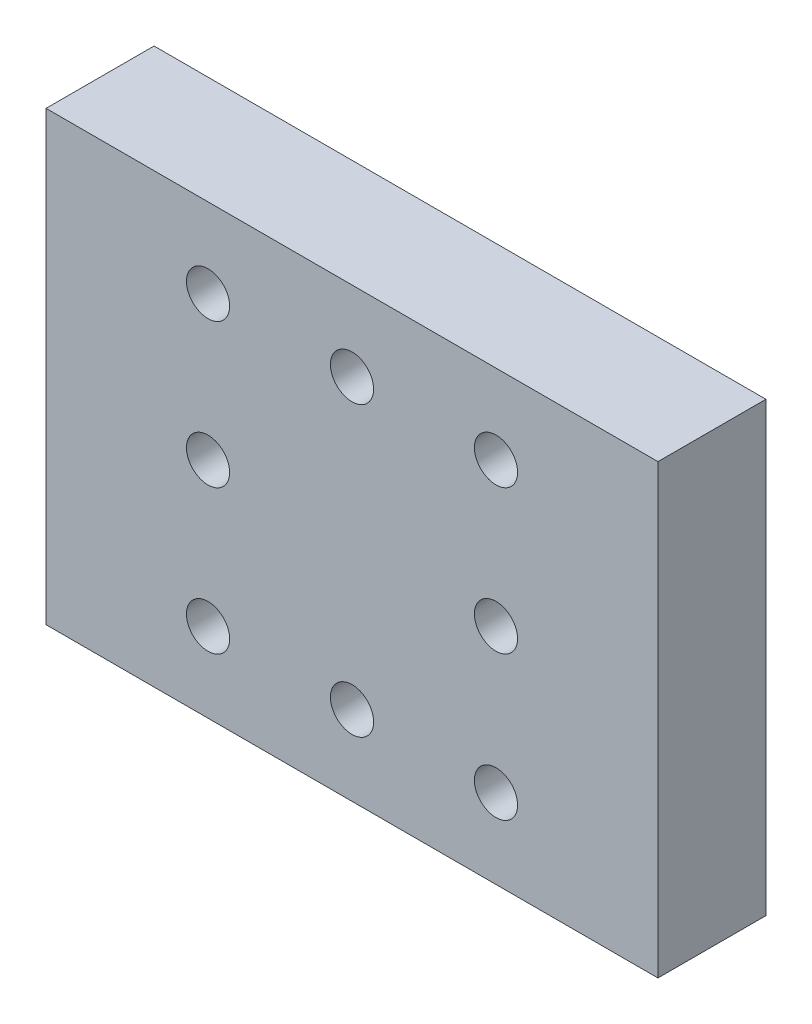
ISO-10303-21;
HEADER;
FILE_DESCRIPTION(('STEP AP214'),'2;1');
FILE_NAME('part.step','',(''),(''),'','','');
FILE_SCHEMA(('AUTOMOTIVE_DESIGN { 1 0 10303 214 1 1 1 1 }'));
ENDSEC;
DATA;
#1=APPLICATION_CONTEXT('core data for automotive mechanical design processes');
#2=APPLICATION_PROTOCOL_DEFINITION('international standard','automotive_design',2000,#1);
#3=PRODUCT_CONTEXT('',#1,'mechanical');
#4=PRODUCT('Part','Part','',(#3));
#5=PRODUCT_RELATED_PRODUCT_CATEGORY('part','',(#4));
#6=PRODUCT_DEFINITION_FORMATION('','',#4);
#7=PRODUCT_DEFINITION_CONTEXT('part definition',#1,'design');
#8=PRODUCT_DEFINITION('design','',#6,#7);
#9=PRODUCT_DEFINITION_SHAPE('','',#8);
#10=(LENGTH_UNIT() NAMED_UNIT(*) SI_UNIT(.MILLI.,.METRE.));
#11=(NAMED_UNIT(*) PLANE_ANGLE_UNIT() SI_UNIT($,.RADIAN.));
#12=(NAMED_UNIT(*) SI_UNIT($,.STERADIAN.) SOLID_ANGLE_UNIT());
#13=UNCERTAINTY_MEASURE_WITH_UNIT(LENGTH_MEASURE(1.E-05),#10,'distance_accuracy_value','');
#14=(GEOMETRIC_REPRESENTATION_CONTEXT(3) GLOBAL_UNCERTAINTY_ASSIGNED_CONTEXT((#13)) GLOBAL_UNIT_ASSIGNED_CONTEXT((#10,
#11,#12)) REPRESENTATION_CONTEXT('',''));
#15=CARTESIAN_POINT('',(0.,0.,0.));
#16=DIRECTION('',(0.,0.,1.));
#17=DIRECTION('',(1.,0.,0.));
#18=AXIS2_PLACEMENT_3D('',#15,#16,#17);
#19=CARTESIAN_POINT('',(16.9999999999999,12.425,6.));
#20=DIRECTION('',(-1.,0.,0.));
#21=DIRECTION('',(0.,-1.,0.));
#22=AXIS2_PLACEMENT_3D('',#19,#20,#21);
#23=PLANE('',#22);
#24=DIRECTION('',(0.,1.,0.));
#25=VECTOR('',#24,1.);
#26=CARTESIAN_POINT('',(16.9999999999999,12.425,0.));
#27=LINE('',#26,#25);
#28=CARTESIAN_POINT('',(16.9999999999999,-12.425,0.));
#29=VERTEX_POINT('',#28);
#30=CARTESIAN_POINT('',(16.9999999999999,12.425,0.));
#31=VERTEX_POINT('',#30);
#32=EDGE_CURVE('E95',#29,#31,#27,.T.);
#33=ORIENTED_EDGE('',*,*,#32,.T.);
#34=DIRECTION('',(0.,0.,-1.));
#35=VECTOR('',#34,1.);
#36=CARTESIAN_POINT('',(16.9999999999999,12.425,6.));
#37=LINE('',#36,#35);
#38=CARTESIAN_POINT('',(16.9999999999999,12.425,6.));
#39=VERTEX_POINT('',#38);
#40=EDGE_CURVE('E11',#39,#31,#37,.T.);
#41=ORIENTED_EDGE('',*,*,#40,.F.);
#42=DIRECTION('',(0.,1.,0.));
#43=VECTOR('',#42,1.);
#44=CARTESIAN_POINT('',(16.9999999999999,12.425,6.));
#45=LINE('',#44,#43);
#46=CARTESIAN_POINT('',(16.9999999999999,-12.425,6.));
#47=VERTEX_POINT('',#46);
#48=EDGE_CURVE('E83',#47,#39,#45,.T.);
#49=ORIENTED_EDGE('',*,*,#48,.F.);
#50=DIRECTION('',(0.,0.,-1.));
#51=VECTOR('',#50,1.);
#52=CARTESIAN_POINT('',(16.9999999999999,-12.425,6.));
#53=LINE('',#52,#51);
#54=EDGE_CURVE('E91',#47,#29,#53,.T.);
#55=ORIENTED_EDGE('',*,*,#54,.T.);
#56=EDGE_LOOP('',(#33,#41,#49,#55));
#57=FACE_BOUND('',#56,.T.);
#58=ADVANCED_FACE('F32',(#57),#23,.F.);
#59=CARTESIAN_POINT('',(-17.,12.425,6.));
#60=DIRECTION('',(0.,-1.,0.));
#61=DIRECTION('',(0.,0.,-1.));
#62=AXIS2_PLACEMENT_3D('',#59,#60,#61);
#63=PLANE('',#62);
#64=DIRECTION('',(-1.,0.,0.));
#65=VECTOR('',#64,1.);
#66=CARTESIAN_POINT('',(-17.,12.425,0.));
#67=LINE('',#66,#65);
#68=CARTESIAN_POINT('',(-17.,12.425,0.));
#69=VERTEX_POINT('',#68);
#70=EDGE_CURVE('E87',#31,#69,#67,.T.);
#71=ORIENTED_EDGE('',*,*,#70,.T.);
#72=DIRECTION('',(0.,0.,-1.));
#73=VECTOR('',#72,1.);
#74=CARTESIAN_POINT('',(-17.,12.425,6.));
#75=LINE('',#74,#73);
#76=CARTESIAN_POINT('',(-17.,12.425,6.));
#77=VERTEX_POINT('',#76);
#78=EDGE_CURVE('E40',#77,#69,#75,.T.);
#79=ORIENTED_EDGE('',*,*,#78,.F.);
#80=DIRECTION('',(-1.,0.,0.));
#81=VECTOR('',#80,1.);
#82=CARTESIAN_POINT('',(-17.,12.425,6.));
#83=LINE('',#82,#81);
#84=EDGE_CURVE('E78',#39,#77,#83,.T.);
#85=ORIENTED_EDGE('',*,*,#84,.F.);
#86=ORIENTED_EDGE('',*,*,#40,.T.);
#87=EDGE_LOOP('',(#71,#79,#85,#86));
#88=FACE_BOUND('',#87,.T.);
#89=ADVANCED_FACE('F86',(#88),#63,.F.);
#90=CARTESIAN_POINT('',(-17.,12.425,6.));
#91=DIRECTION('',(1.,0.,0.));
#92=DIRECTION('',(0.,1.,0.));
#93=AXIS2_PLACEMENT_3D('',#90,#91,#92);
#94=PLANE('',#93);
#95=DIRECTION('',(0.,-1.,0.));
#96=VECTOR('',#95,1.);
#97=CARTESIAN_POINT('',(-17.,12.425,0.));
#98=LINE('',#97,#96);
#99=CARTESIAN_POINT('',(-17.,-12.425,0.));
#100=VERTEX_POINT('',#99);
#101=EDGE_CURVE('E65',#69,#100,#98,.T.);
#102=ORIENTED_EDGE('',*,*,#101,.T.);
#103=DIRECTION('',(0.,0.,-1.));
#104=VECTOR('',#103,1.);
#105=CARTESIAN_POINT('',(-17.,-12.425,6.));
#106=LINE('',#105,#104);
#107=CARTESIAN_POINT('',(-17.,-12.425,6.));
#108=VERTEX_POINT('',#107);
#109=EDGE_CURVE('E88',#108,#100,#106,.T.);
#110=ORIENTED_EDGE('',*,*,#109,.F.);
#111=DIRECTION('',(0.,-1.,0.));
#112=VECTOR('',#111,1.);
#113=CARTESIAN_POINT('',(-17.,12.425,6.));
#114=LINE('',#113,#112);
#115=EDGE_CURVE('E81',#77,#108,#114,.T.);
#116=ORIENTED_EDGE('',*,*,#115,.F.);
#117=ORIENTED_EDGE('',*,*,#78,.T.);
#118=EDGE_LOOP('',(#102,#110,#116,#117));
#119=FACE_BOUND('',#118,.T.);
#120=ADVANCED_FACE('F89',(#119),#94,.F.);
#121=CARTESIAN_POINT('',(-17.,-12.425,6.));
#122=DIRECTION('',(0.,1.,0.));
#123=DIRECTION('',(0.,0.,1.));
#124=AXIS2_PLACEMENT_3D('',#121,#122,#123);
#125=PLANE('',#124);
#126=DIRECTION('',(1.,0.,0.));
#127=VECTOR('',#126,1.);
#128=CARTESIAN_POINT('',(-17.,-12.425,0.));
#129=LINE('',#128,#127);
#130=EDGE_CURVE('E71',#100,#29,#129,.T.);
#131=ORIENTED_EDGE('',*,*,#130,.T.);
#132=ORIENTED_EDGE('',*,*,#54,.F.);
#133=DIRECTION('',(1.,0.,0.));
#134=VECTOR('',#133,1.);
#135=CARTESIAN_POINT('',(-17.,-12.425,6.));
#136=LINE('',#135,#134);
#137=EDGE_CURVE('E48',#108,#47,#136,.T.);
#138=ORIENTED_EDGE('',*,*,#137,.F.);
#139=ORIENTED_EDGE('',*,*,#109,.T.);
#140=EDGE_LOOP('',(#131,#132,#138,#139));
#141=FACE_BOUND('',#140,.T.);
#142=ADVANCED_FACE('F103',(#141),#125,.F.);
#143=CARTESIAN_POINT('',(0.,0.,6.));
#144=DIRECTION('',(0.,0.,1.));
#145=DIRECTION('',(1.,0.,0.));
#146=AXIS2_PLACEMENT_3D('',#143,#144,#145);
#147=PLANE('',#146);
#148=CARTESIAN_POINT('',(8.00000000003318,0.,6.));
#149=DIRECTION('',(0.,0.,1.));
#150=DIRECTION('',(1.,0.,0.));
#151=AXIS2_PLACEMENT_3D('',#148,#149,#150);
#152=CIRCLE('',#151,1.2);
#153=CARTESIAN_POINT('',(9.20000000003318,0.,6.));
#154=VERTEX_POINT('',#153);
#155=EDGE_CURVE('E151',#154,#154,#152,.T.);
#156=ORIENTED_EDGE('',*,*,#155,.F.);
#157=EDGE_LOOP('',(#156));
#158=FACE_BOUND('',#157,.T.);
#159=CARTESIAN_POINT('',(-7.99999999997646,0.,6.));
#160=DIRECTION('',(0.,0.,1.));
#161=DIRECTION('',(1.,0.,0.));
#162=AXIS2_PLACEMENT_3D('',#159,#160,#161);
#163=CIRCLE('',#162,1.2);
#164=CARTESIAN_POINT('',(-6.79999999997646,0.,6.));
#165=VERTEX_POINT('',#164);
#166=EDGE_CURVE('E145',#165,#165,#163,.T.);
#167=ORIENTED_EDGE('',*,*,#166,.F.);
#168=EDGE_LOOP('',(#167));
#169=FACE_BOUND('',#168,.T.);
#170=CARTESIAN_POINT('',(-7.99999999999999,-8.00500000000016,6.));
#171=DIRECTION('',(0.,0.,1.));
#172=DIRECTION('',(-1.,0.,0.));
#173=AXIS2_PLACEMENT_3D('',#170,#171,#172);
#174=CIRCLE('',#173,1.2);
#175=CARTESIAN_POINT('',(-9.19999999999999,-8.00500000000016,6.));
#176=VERTEX_POINT('',#175);
#177=EDGE_CURVE('E139',#176,#176,#174,.T.);
#178=ORIENTED_EDGE('',*,*,#177,.F.);
#179=EDGE_LOOP('',(#178));
#180=FACE_BOUND('',#179,.T.);
#181=CARTESIAN_POINT('',(7.99999999999973,-8.00500000000017,6.));
#182=DIRECTION('',(0.,0.,1.));
#183=DIRECTION('',(1.,0.,0.));
#184=AXIS2_PLACEMENT_3D('',#181,#182,#183);
#185=CIRCLE('',#184,1.2);
#186=CARTESIAN_POINT('',(9.19999999999973,-8.00500000000017,6.));
#187=VERTEX_POINT('',#186);
#188=EDGE_CURVE('E133',#187,#187,#185,.T.);
#189=ORIENTED_EDGE('',*,*,#188,.F.);
#190=EDGE_LOOP('',(#189));
#191=FACE_BOUND('',#190,.T.);
#192=CARTESIAN_POINT('',(-1.29973142336363E-13,-8.00499999999875,6.));
#193=DIRECTION('',(0.,0.,1.));
#194=DIRECTION('',(-1.,0.,0.));
#195=AXIS2_PLACEMENT_3D('',#192,#193,#194);
#196=CIRCLE('',#195,1.2);
#197=CARTESIAN_POINT('',(-1.20000000000013,-8.00499999999875,6.));
#198=VERTEX_POINT('',#197);
#199=EDGE_CURVE('E127',#198,#198,#196,.T.);
#200=ORIENTED_EDGE('',*,*,#199,.F.);
#201=EDGE_LOOP('',(#200));
#202=FACE_BOUND('',#201,.T.);
#203=CARTESIAN_POINT('',(-1.29973142336363E-13,8.00499999999857,6.));
#204=DIRECTION('',(0.,0.,1.));
#205=DIRECTION('',(1.,0.,0.));
#206=AXIS2_PLACEMENT_3D('',#203,#204,#205);
#207=CIRCLE('',#206,1.2);
#208=CARTESIAN_POINT('',(1.19999999999987,8.00499999999857,6.));
#209=VERTEX_POINT('',#208);
#210=EDGE_CURVE('E121',#209,#209,#207,.T.);
#211=ORIENTED_EDGE('',*,*,#210,.F.);
#212=EDGE_LOOP('',(#211));
#213=FACE_BOUND('',#212,.T.);
#214=CARTESIAN_POINT('',(7.99999999999973,8.00499999999999,6.));
#215=DIRECTION('',(0.,0.,1.));
#216=DIRECTION('',(-1.,0.,0.));
#217=AXIS2_PLACEMENT_3D('',#214,#215,#216);
#218=CIRCLE('',#217,1.2);
#219=CARTESIAN_POINT('',(6.79999999999973,8.00499999999999,6.));
#220=VERTEX_POINT('',#219);
#221=EDGE_CURVE('E115',#220,#220,#218,.T.);
#222=ORIENTED_EDGE('',*,*,#221,.F.);
#223=EDGE_LOOP('',(#222));
#224=FACE_BOUND('',#223,.T.);
#225=CARTESIAN_POINT('',(-7.99999999999999,8.00499999999999,6.));
#226=DIRECTION('',(0.,0.,1.));
#227=DIRECTION('',(1.,0.,0.));
#228=AXIS2_PLACEMENT_3D('',#225,#226,#227);
#229=CIRCLE('',#228,1.2);
#230=CARTESIAN_POINT('',(-6.79999999999999,8.00499999999999,6.));
#231=VERTEX_POINT('',#230);
#232=EDGE_CURVE('E109',#231,#231,#229,.T.);
#233=ORIENTED_EDGE('',*,*,#232,.F.);
#234=EDGE_LOOP('',(#233));
#235=FACE_BOUND('',#234,.T.);
#236=ORIENTED_EDGE('',*,*,#48,.T.);
#237=ORIENTED_EDGE('',*,*,#84,.T.);
#238=ORIENTED_EDGE('',*,*,#115,.T.);
#239=ORIENTED_EDGE('',*,*,#137,.T.);
#240=EDGE_LOOP('',(#236,#237,#238,#239));
#241=FACE_BOUND('',#240,.T.);
#242=ADVANCED_FACE('F79',(#158,#169,#180,#191,#202,#213,#224,#235,#241),#147,.T.);
#243=CARTESIAN_POINT('',(0.,0.,0.));
#244=DIRECTION('',(0.,0.,1.));
#245=DIRECTION('',(1.,0.,0.));
#246=AXIS2_PLACEMENT_3D('',#243,#244,#245);
#247=PLANE('',#246);
#248=CARTESIAN_POINT('',(8.00000000003318,0.,0.));
#249=DIRECTION('',(0.,0.,1.));
#250=DIRECTION('',(1.,0.,0.));
#251=AXIS2_PLACEMENT_3D('',#248,#249,#250);
#252=CIRCLE('',#251,1.2);
#253=CARTESIAN_POINT('',(9.20000000003318,0.,0.));
#254=VERTEX_POINT('',#253);
#255=EDGE_CURVE('E148',#254,#254,#252,.T.);
#256=ORIENTED_EDGE('',*,*,#255,.T.);
#257=EDGE_LOOP('',(#256));
#258=FACE_BOUND('',#257,.T.);
#259=CARTESIAN_POINT('',(-7.99999999997646,0.,0.));
#260=DIRECTION('',(0.,0.,1.));
#261=DIRECTION('',(1.,0.,0.));
#262=AXIS2_PLACEMENT_3D('',#259,#260,#261);
#263=CIRCLE('',#262,1.2);
#264=CARTESIAN_POINT('',(-6.79999999997646,0.,0.));
#265=VERTEX_POINT('',#264);
#266=EDGE_CURVE('E142',#265,#265,#263,.T.);
#267=ORIENTED_EDGE('',*,*,#266,.T.);
#268=EDGE_LOOP('',(#267));
#269=FACE_BOUND('',#268,.T.);
#270=CARTESIAN_POINT('',(-7.99999999999999,-8.00500000000016,0.));
#271=DIRECTION('',(0.,0.,1.));
#272=DIRECTION('',(-1.,0.,0.));
#273=AXIS2_PLACEMENT_3D('',#270,#271,#272);
#274=CIRCLE('',#273,1.2);
#275=CARTESIAN_POINT('',(-9.19999999999999,-8.00500000000016,0.));
#276=VERTEX_POINT('',#275);
#277=EDGE_CURVE('E136',#276,#276,#274,.T.);
#278=ORIENTED_EDGE('',*,*,#277,.T.);
#279=EDGE_LOOP('',(#278));
#280=FACE_BOUND('',#279,.T.);
#281=CARTESIAN_POINT('',(7.99999999999973,-8.00500000000017,0.));
#282=DIRECTION('',(0.,0.,1.));
#283=DIRECTION('',(1.,0.,0.));
#284=AXIS2_PLACEMENT_3D('',#281,#282,#283);
#285=CIRCLE('',#284,1.2);
#286=CARTESIAN_POINT('',(9.19999999999973,-8.00500000000017,0.));
#287=VERTEX_POINT('',#286);
#288=EDGE_CURVE('E130',#287,#287,#285,.T.);
#289=ORIENTED_EDGE('',*,*,#288,.T.);
#290=EDGE_LOOP('',(#289));
#291=FACE_BOUND('',#290,.T.);
#292=CARTESIAN_POINT('',(-1.29973142336363E-13,-8.00499999999875,0.));
#293=DIRECTION('',(0.,0.,1.));
#294=DIRECTION('',(-1.,0.,0.));
#295=AXIS2_PLACEMENT_3D('',#292,#293,#294);
#296=CIRCLE('',#295,1.2);
#297=CARTESIAN_POINT('',(-1.20000000000013,-8.00499999999875,0.));
#298=VERTEX_POINT('',#297);
#299=EDGE_CURVE('E124',#298,#298,#296,.T.);
#300=ORIENTED_EDGE('',*,*,#299,.T.);
#301=EDGE_LOOP('',(#300));
#302=FACE_BOUND('',#301,.T.);
#303=CARTESIAN_POINT('',(-1.29973142336363E-13,8.00499999999857,0.));
#304=DIRECTION('',(0.,0.,1.));
#305=DIRECTION('',(1.,0.,0.));
#306=AXIS2_PLACEMENT_3D('',#303,#304,#305);
#307=CIRCLE('',#306,1.2);
#308=CARTESIAN_POINT('',(1.19999999999987,8.00499999999857,0.));
#309=VERTEX_POINT('',#308);
#310=EDGE_CURVE('E118',#309,#309,#307,.T.);
#311=ORIENTED_EDGE('',*,*,#310,.T.);
#312=EDGE_LOOP('',(#311));
#313=FACE_BOUND('',#312,.T.);
#314=CARTESIAN_POINT('',(7.99999999999973,8.00499999999999,0.));
#315=DIRECTION('',(0.,0.,1.));
#316=DIRECTION('',(-1.,0.,0.));
#317=AXIS2_PLACEMENT_3D('',#314,#315,#316);
#318=CIRCLE('',#317,1.2);
#319=CARTESIAN_POINT('',(6.79999999999973,8.00499999999999,0.));
#320=VERTEX_POINT('',#319);
#321=EDGE_CURVE('E112',#320,#320,#318,.T.);
#322=ORIENTED_EDGE('',*,*,#321,.T.);
#323=EDGE_LOOP('',(#322));
#324=FACE_BOUND('',#323,.T.);
#325=CARTESIAN_POINT('',(-7.99999999999999,8.00499999999999,0.));
#326=DIRECTION('',(0.,0.,1.));
#327=DIRECTION('',(1.,0.,0.));
#328=AXIS2_PLACEMENT_3D('',#325,#326,#327);
#329=CIRCLE('',#328,1.2);
#330=CARTESIAN_POINT('',(-6.79999999999999,8.00499999999999,0.));
#331=VERTEX_POINT('',#330);
#332=EDGE_CURVE('E98',#331,#331,#329,.T.);
#333=ORIENTED_EDGE('',*,*,#332,.T.);
#334=EDGE_LOOP('',(#333));
#335=FACE_BOUND('',#334,.T.);
#336=ORIENTED_EDGE('',*,*,#32,.F.);
#337=ORIENTED_EDGE('',*,*,#130,.F.);
#338=ORIENTED_EDGE('',*,*,#101,.F.);
#339=ORIENTED_EDGE('',*,*,#70,.F.);
#340=EDGE_LOOP('',(#336,#337,#338,#339));
#341=FACE_BOUND('',#340,.T.);
#342=ADVANCED_FACE('F106',(#258,#269,#280,#291,#302,#313,#324,#335,#341),#247,.F.);
#343=CARTESIAN_POINT('',(-7.99999999999999,8.00499999999999,0.));
#344=DIRECTION('',(0.,0.,1.));
#345=DIRECTION('',(1.,0.,0.));
#346=AXIS2_PLACEMENT_3D('',#343,#344,#345);
#347=CYLINDRICAL_SURFACE('',#346,1.2);
#348=ORIENTED_EDGE('',*,*,#332,.F.);
#349=EDGE_LOOP('',(#348));
#350=FACE_BOUND('',#349,.T.);
#351=ORIENTED_EDGE('',*,*,#232,.T.);
#352=EDGE_LOOP('',(#351));
#353=FACE_BOUND('',#352,.T.);
#354=ADVANCED_FACE('F183',(#350,#353),#347,.F.);
#355=CARTESIAN_POINT('',(7.99999999999973,8.00499999999999,0.));
#356=DIRECTION('',(0.,0.,1.));
#357=DIRECTION('',(1.,0.,0.));
#358=AXIS2_PLACEMENT_3D('',#355,#356,#357);
#359=CYLINDRICAL_SURFACE('',#358,1.2);
#360=ORIENTED_EDGE('',*,*,#321,.F.);
#361=EDGE_LOOP('',(#360));
#362=FACE_BOUND('',#361,.T.);
#363=ORIENTED_EDGE('',*,*,#221,.T.);
#364=EDGE_LOOP('',(#363));
#365=FACE_BOUND('',#364,.T.);
#366=ADVANCED_FACE('F185',(#362,#365),#359,.F.);
#367=CARTESIAN_POINT('',(-1.29973142336363E-13,8.00499999999857,0.));
#368=DIRECTION('',(0.,0.,1.));
#369=DIRECTION('',(1.,0.,0.));
#370=AXIS2_PLACEMENT_3D('',#367,#368,#369);
#371=CYLINDRICAL_SURFACE('',#370,1.2);
#372=ORIENTED_EDGE('',*,*,#310,.F.);
#373=EDGE_LOOP('',(#372));
#374=FACE_BOUND('',#373,.T.);
#375=ORIENTED_EDGE('',*,*,#210,.T.);
#376=EDGE_LOOP('',(#375));
#377=FACE_BOUND('',#376,.T.);
#378=ADVANCED_FACE('F192',(#374,#377),#371,.F.);
#379=CARTESIAN_POINT('',(-1.29973142336363E-13,-8.00499999999875,0.));
#380=DIRECTION('',(0.,0.,1.));
#381=DIRECTION('',(1.,0.,0.));
#382=AXIS2_PLACEMENT_3D('',#379,#380,#381);
#383=CYLINDRICAL_SURFACE('',#382,1.2);
#384=ORIENTED_EDGE('',*,*,#299,.F.);
#385=EDGE_LOOP('',(#384));
#386=FACE_BOUND('',#385,.T.);
#387=ORIENTED_EDGE('',*,*,#199,.T.);
#388=EDGE_LOOP('',(#387));
#389=FACE_BOUND('',#388,.T.);
#390=ADVANCED_FACE('F238',(#386,#389),#383,.F.);
#391=CARTESIAN_POINT('',(7.99999999999973,-8.00500000000017,0.));
#392=DIRECTION('',(0.,0.,1.));
#393=DIRECTION('',(1.,0.,0.));
#394=AXIS2_PLACEMENT_3D('',#391,#392,#393);
#395=CYLINDRICAL_SURFACE('',#394,1.2);
#396=ORIENTED_EDGE('',*,*,#288,.F.);
#397=EDGE_LOOP('',(#396));
#398=FACE_BOUND('',#397,.T.);
#399=ORIENTED_EDGE('',*,*,#188,.T.);
#400=EDGE_LOOP('',(#399));
#401=FACE_BOUND('',#400,.T.);
#402=ADVANCED_FACE('F248',(#398,#401),#395,.F.);
#403=CARTESIAN_POINT('',(-7.99999999999999,-8.00500000000016,0.));
#404=DIRECTION('',(0.,0.,1.));
#405=DIRECTION('',(1.,0.,0.));
#406=AXIS2_PLACEMENT_3D('',#403,#404,#405);
#407=CYLINDRICAL_SURFACE('',#406,1.2);
#408=ORIENTED_EDGE('',*,*,#277,.F.);
#409=EDGE_LOOP('',(#408));
#410=FACE_BOUND('',#409,.T.);
#411=ORIENTED_EDGE('',*,*,#177,.T.);
#412=EDGE_LOOP('',(#411));
#413=FACE_BOUND('',#412,.T.);
#414=ADVANCED_FACE('F258',(#410,#413),#407,.F.);
#415=CARTESIAN_POINT('',(-7.99999999997646,0.,0.));
#416=DIRECTION('',(0.,0.,1.));
#417=DIRECTION('',(1.,0.,0.));
#418=AXIS2_PLACEMENT_3D('',#415,#416,#417);
#419=CYLINDRICAL_SURFACE('',#418,1.2);
#420=ORIENTED_EDGE('',*,*,#266,.F.);
#421=EDGE_LOOP('',(#420));
#422=FACE_BOUND('',#421,.T.);
#423=ORIENTED_EDGE('',*,*,#166,.T.);
#424=EDGE_LOOP('',(#423));
#425=FACE_BOUND('',#424,.T.);
#426=ADVANCED_FACE('F162',(#422,#425),#419,.F.);
#427=CARTESIAN_POINT('',(8.00000000003318,0.,0.));
#428=DIRECTION('',(0.,0.,1.));
#429=DIRECTION('',(1.,0.,0.));
#430=AXIS2_PLACEMENT_3D('',#427,#428,#429);
#431=CYLINDRICAL_SURFACE('',#430,1.2);
#432=ORIENTED_EDGE('',*,*,#255,.F.);
#433=EDGE_LOOP('',(#432));
#434=FACE_BOUND('',#433,.T.);
#435=ORIENTED_EDGE('',*,*,#155,.T.);
#436=EDGE_LOOP('',(#435));
#437=FACE_BOUND('',#436,.T.);
#438=ADVANCED_FACE('F159',(#434,#437),#431,.F.);
#439=CLOSED_SHELL('',(#58,#89,#120,#142,#242,#342,#354,#366,#378,#390,#402,#414,#426,#438));
#440=MANIFOLD_SOLID_BREP('B2',#439);
#441=ADVANCED_BREP_SHAPE_REPRESENTATION('',(#18,#440),#14);
#442=SHAPE_DEFINITION_REPRESENTATION(#9,#441);
ENDSEC;
END-ISO-10303-21;
